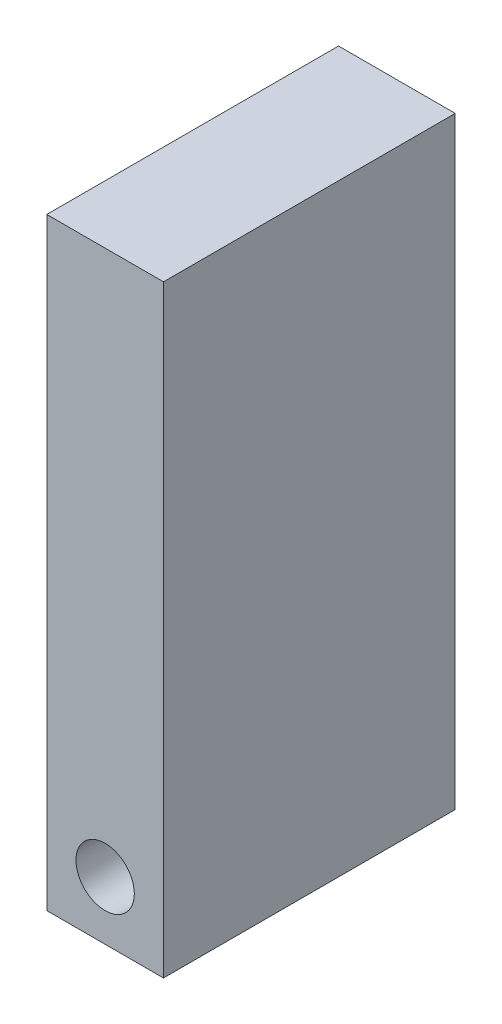
ISO-10303-21;
HEADER;
FILE_DESCRIPTION(('STEP AP214'),'2;1');
FILE_NAME('part.step','',(''),(''),'','','');
FILE_SCHEMA(('AUTOMOTIVE_DESIGN { 1 0 10303 214 1 1 1 1 }'));
ENDSEC;
DATA;
#1=APPLICATION_CONTEXT('core data for automotive mechanical design processes');
#2=APPLICATION_PROTOCOL_DEFINITION('international standard','automotive_design',2000,#1);
#3=PRODUCT_CONTEXT('',#1,'mechanical');
#4=PRODUCT('Part','Part','',(#3));
#5=PRODUCT_RELATED_PRODUCT_CATEGORY('part','',(#4));
#6=PRODUCT_DEFINITION_FORMATION('','',#4);
#7=PRODUCT_DEFINITION_CONTEXT('part definition',#1,'design');
#8=PRODUCT_DEFINITION('design','',#6,#7);
#9=PRODUCT_DEFINITION_SHAPE('','',#8);
#10=(LENGTH_UNIT() NAMED_UNIT(*) SI_UNIT(.MILLI.,.METRE.));
#11=(NAMED_UNIT(*) PLANE_ANGLE_UNIT() SI_UNIT($,.RADIAN.));
#12=(NAMED_UNIT(*) SI_UNIT($,.STERADIAN.) SOLID_ANGLE_UNIT());
#13=UNCERTAINTY_MEASURE_WITH_UNIT(LENGTH_MEASURE(1.E-05),#10,'distance_accuracy_value','');
#14=(GEOMETRIC_REPRESENTATION_CONTEXT(3) GLOBAL_UNCERTAINTY_ASSIGNED_CONTEXT((#13)) GLOBAL_UNIT_ASSIGNED_CONTEXT((#10,
#11,#12)) REPRESENTATION_CONTEXT('',''));
#15=CARTESIAN_POINT('',(0.,0.,0.));
#16=DIRECTION('',(0.,0.,1.));
#17=DIRECTION('',(1.,0.,0.));
#18=AXIS2_PLACEMENT_3D('',#15,#16,#17);
#19=CARTESIAN_POINT('',(0.,0.,20.));
#20=DIRECTION('',(0.,0.,-1.));
#21=DIRECTION('',(-1.,0.,0.));
#22=AXIS2_PLACEMENT_3D('',#19,#20,#21);
#23=PLANE('',#22);
#24=DIRECTION('',(0.,-1.,0.));
#25=VECTOR('',#24,1.);
#26=CARTESIAN_POINT('',(0.,-28.,20.));
#27=LINE('',#26,#25);
#28=CARTESIAN_POINT('',(0.,3.,20.));
#29=VERTEX_POINT('',#28);
#30=CARTESIAN_POINT('',(0.,-28.,20.));
#31=VERTEX_POINT('',#30);
#32=EDGE_CURVE('E103',#29,#31,#27,.T.);
#33=ORIENTED_EDGE('',*,*,#32,.T.);
#34=DIRECTION('',(1.,0.,0.));
#35=VECTOR('',#34,1.);
#36=CARTESIAN_POINT('',(6.,-28.,20.));
#37=LINE('',#36,#35);
#38=CARTESIAN_POINT('',(6.,-28.,20.));
#39=VERTEX_POINT('',#38);
#40=EDGE_CURVE('E57',#31,#39,#37,.T.);
#41=ORIENTED_EDGE('',*,*,#40,.T.);
#42=DIRECTION('',(0.,1.,0.));
#43=VECTOR('',#42,1.);
#44=CARTESIAN_POINT('',(6.,0.,20.));
#45=LINE('',#44,#43);
#46=CARTESIAN_POINT('',(6.,3.,20.));
#47=VERTEX_POINT('',#46);
#48=EDGE_CURVE('E106',#39,#47,#45,.T.);
#49=ORIENTED_EDGE('',*,*,#48,.T.);
#50=DIRECTION('',(1.,0.,0.));
#51=VECTOR('',#50,1.);
#52=CARTESIAN_POINT('',(6.,3.,20.));
#53=LINE('',#52,#51);
#54=EDGE_CURVE('E91',#29,#47,#53,.T.);
#55=ORIENTED_EDGE('',*,*,#54,.F.);
#56=EDGE_LOOP('',(#33,#41,#49,#55));
#57=FACE_BOUND('',#56,.T.);
#58=CARTESIAN_POINT('',(3.,-25.,20.));
#59=DIRECTION('',(0.,0.,1.));
#60=DIRECTION('',(1.,0.,0.));
#61=AXIS2_PLACEMENT_3D('',#58,#59,#60);
#62=CIRCLE('',#61,1.5);
#63=CARTESIAN_POINT('',(4.5,-25.,20.));
#64=VERTEX_POINT('',#63);
#65=EDGE_CURVE('E100',#64,#64,#62,.T.);
#66=ORIENTED_EDGE('',*,*,#65,.F.);
#67=EDGE_LOOP('',(#66));
#68=FACE_BOUND('',#67,.T.);
#69=ADVANCED_FACE('F35',(#57,#68),#23,.F.);
#70=CARTESIAN_POINT('',(0.,-28.,20.));
#71=DIRECTION('',(1.,0.,0.));
#72=DIRECTION('',(0.,0.,-1.));
#73=AXIS2_PLACEMENT_3D('',#70,#71,#72);
#74=PLANE('',#73);
#75=DIRECTION('',(0.,0.,1.));
#76=VECTOR('',#75,1.);
#77=CARTESIAN_POINT('',(0.,3.,20.));
#78=LINE('',#77,#76);
#79=CARTESIAN_POINT('',(0.,3.,5.));
#80=VERTEX_POINT('',#79);
#81=EDGE_CURVE('E92',#80,#29,#78,.T.);
#82=ORIENTED_EDGE('',*,*,#81,.F.);
#83=DIRECTION('',(0.,-1.,0.));
#84=VECTOR('',#83,1.);
#85=CARTESIAN_POINT('',(0.,-28.,5.));
#86=LINE('',#85,#84);
#87=CARTESIAN_POINT('',(0.,-28.,5.));
#88=VERTEX_POINT('',#87);
#89=EDGE_CURVE('E49',#80,#88,#86,.T.);
#90=ORIENTED_EDGE('',*,*,#89,.T.);
#91=DIRECTION('',(0.,0.,-1.));
#92=VECTOR('',#91,1.);
#93=CARTESIAN_POINT('',(0.,-28.,20.));
#94=LINE('',#93,#92);
#95=EDGE_CURVE('E43',#31,#88,#94,.T.);
#96=ORIENTED_EDGE('',*,*,#95,.F.);
#97=ORIENTED_EDGE('',*,*,#32,.F.);
#98=EDGE_LOOP('',(#82,#90,#96,#97));
#99=FACE_BOUND('',#98,.T.);
#100=ADVANCED_FACE('F37',(#99),#74,.F.);
#101=CARTESIAN_POINT('',(6.,-28.,20.));
#102=DIRECTION('',(0.,1.,0.));
#103=DIRECTION('',(0.,0.,1.));
#104=AXIS2_PLACEMENT_3D('',#101,#102,#103);
#105=PLANE('',#104);
#106=ORIENTED_EDGE('',*,*,#95,.T.);
#107=DIRECTION('',(1.,0.,0.));
#108=VECTOR('',#107,1.);
#109=CARTESIAN_POINT('',(-2.,-28.,5.));
#110=LINE('',#109,#108);
#111=CARTESIAN_POINT('',(6.,-28.,5.));
#112=VERTEX_POINT('',#111);
#113=EDGE_CURVE('E86',#88,#112,#110,.T.);
#114=ORIENTED_EDGE('',*,*,#113,.T.);
#115=DIRECTION('',(0.,0.,-1.));
#116=VECTOR('',#115,1.);
#117=CARTESIAN_POINT('',(6.,-28.,20.));
#118=LINE('',#117,#116);
#119=EDGE_CURVE('E85',#39,#112,#118,.T.);
#120=ORIENTED_EDGE('',*,*,#119,.F.);
#121=ORIENTED_EDGE('',*,*,#40,.F.);
#122=EDGE_LOOP('',(#106,#114,#120,#121));
#123=FACE_BOUND('',#122,.T.);
#124=ADVANCED_FACE('F111',(#123),#105,.F.);
#125=CARTESIAN_POINT('',(6.,0.,20.));
#126=DIRECTION('',(-1.,0.,0.));
#127=DIRECTION('',(0.,-1.,0.));
#128=AXIS2_PLACEMENT_3D('',#125,#126,#127);
#129=PLANE('',#128);
#130=ORIENTED_EDGE('',*,*,#119,.T.);
#131=DIRECTION('',(0.,-1.,0.));
#132=VECTOR('',#131,1.);
#133=CARTESIAN_POINT('',(6.,-28.,5.));
#134=LINE('',#133,#132);
#135=CARTESIAN_POINT('',(6.,3.,5.));
#136=VERTEX_POINT('',#135);
#137=EDGE_CURVE('E74',#136,#112,#134,.T.);
#138=ORIENTED_EDGE('',*,*,#137,.F.);
#139=DIRECTION('',(0.,0.,-1.));
#140=VECTOR('',#139,1.);
#141=CARTESIAN_POINT('',(6.,3.,20.));
#142=LINE('',#141,#140);
#143=EDGE_CURVE('E84',#47,#136,#142,.T.);
#144=ORIENTED_EDGE('',*,*,#143,.F.);
#145=ORIENTED_EDGE('',*,*,#48,.F.);
#146=EDGE_LOOP('',(#130,#138,#144,#145));
#147=FACE_BOUND('',#146,.T.);
#148=ADVANCED_FACE('F82',(#147),#129,.F.);
#149=CARTESIAN_POINT('',(3.,-25.,20.));
#150=DIRECTION('',(0.,0.,-1.));
#151=DIRECTION('',(-1.,0.,0.));
#152=AXIS2_PLACEMENT_3D('',#149,#150,#151);
#153=CYLINDRICAL_SURFACE('',#152,1.5);
#154=CARTESIAN_POINT('',(3.,-25.,5.));
#155=DIRECTION('',(0.,0.,1.));
#156=DIRECTION('',(1.,0.,0.));
#157=AXIS2_PLACEMENT_3D('',#154,#155,#156);
#158=CIRCLE('',#157,1.5);
#159=CARTESIAN_POINT('',(4.5,-25.,5.));
#160=VERTEX_POINT('',#159);
#161=EDGE_CURVE('E95',#160,#160,#158,.T.);
#162=ORIENTED_EDGE('',*,*,#161,.F.);
#163=EDGE_LOOP('',(#162));
#164=FACE_BOUND('',#163,.T.);
#165=ORIENTED_EDGE('',*,*,#65,.T.);
#166=EDGE_LOOP('',(#165));
#167=FACE_BOUND('',#166,.T.);
#168=ADVANCED_FACE('F119',(#164,#167),#153,.F.);
#169=CARTESIAN_POINT('',(0.,3.,0.));
#170=DIRECTION('',(0.,1.,0.));
#171=DIRECTION('',(0.,0.,1.));
#172=AXIS2_PLACEMENT_3D('',#169,#170,#171);
#173=PLANE('',#172);
#174=DIRECTION('',(1.,0.,0.));
#175=VECTOR('',#174,1.);
#176=CARTESIAN_POINT('',(0.,3.,5.));
#177=LINE('',#176,#175);
#178=EDGE_CURVE('E11',#80,#136,#177,.T.);
#179=ORIENTED_EDGE('',*,*,#178,.F.);
#180=ORIENTED_EDGE('',*,*,#81,.T.);
#181=ORIENTED_EDGE('',*,*,#54,.T.);
#182=ORIENTED_EDGE('',*,*,#143,.T.);
#183=EDGE_LOOP('',(#179,#180,#181,#182));
#184=FACE_BOUND('',#183,.T.);
#185=ADVANCED_FACE('F89',(#184),#173,.T.);
#186=CARTESIAN_POINT('',(-2.,-28.,5.));
#187=DIRECTION('',(0.,0.,1.));
#188=DIRECTION('',(1.,0.,0.));
#189=AXIS2_PLACEMENT_3D('',#186,#187,#188);
#190=PLANE('',#189);
#191=ORIENTED_EDGE('',*,*,#161,.T.);
#192=EDGE_LOOP('',(#191));
#193=FACE_BOUND('',#192,.T.);
#194=ORIENTED_EDGE('',*,*,#178,.T.);
#195=ORIENTED_EDGE('',*,*,#137,.T.);
#196=ORIENTED_EDGE('',*,*,#113,.F.);
#197=ORIENTED_EDGE('',*,*,#89,.F.);
#198=EDGE_LOOP('',(#194,#195,#196,#197));
#199=FACE_BOUND('',#198,.T.);
#200=ADVANCED_FACE('F73',(#193,#199),#190,.F.);
#201=CLOSED_SHELL('',(#69,#100,#124,#148,#168,#185,#200));
#202=MANIFOLD_SOLID_BREP('B2',#201);
#203=ADVANCED_BREP_SHAPE_REPRESENTATION('',(#18,#202),#14);
#204=SHAPE_DEFINITION_REPRESENTATION(#9,#203);
ENDSEC;
END-ISO-10303-21;
